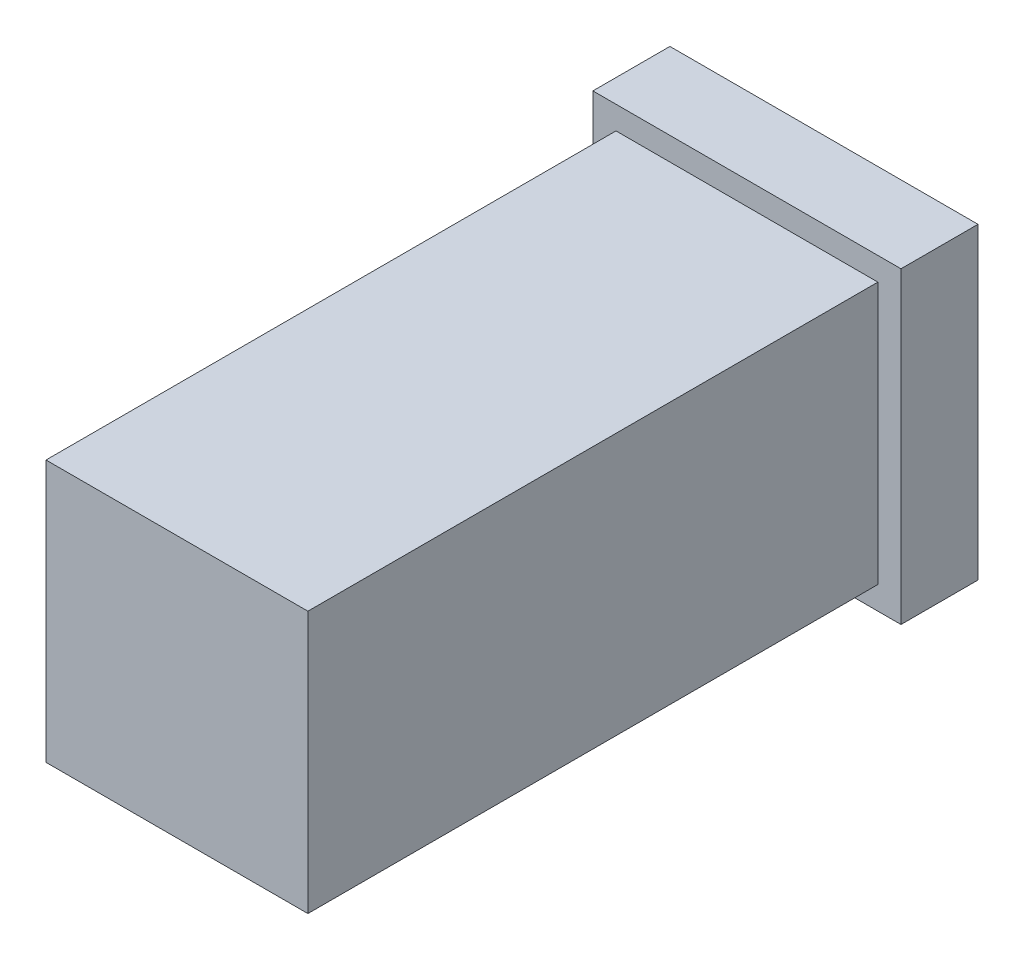
ISO-10303-21;
HEADER;
FILE_DESCRIPTION(('STEP AP214'),'2;1');
FILE_NAME('part.step','',(''),(''),'','','');
FILE_SCHEMA(('AUTOMOTIVE_DESIGN { 1 0 10303 214 1 1 1 1 }'));
ENDSEC;
DATA;
#1=APPLICATION_CONTEXT('core data for automotive mechanical design processes');
#2=APPLICATION_PROTOCOL_DEFINITION('international standard','automotive_design',2000,#1);
#3=PRODUCT_CONTEXT('',#1,'mechanical');
#4=PRODUCT('Part','Part','',(#3));
#5=PRODUCT_RELATED_PRODUCT_CATEGORY('part','',(#4));
#6=PRODUCT_DEFINITION_FORMATION('','',#4);
#7=PRODUCT_DEFINITION_CONTEXT('part definition',#1,'design');
#8=PRODUCT_DEFINITION('design','',#6,#7);
#9=PRODUCT_DEFINITION_SHAPE('','',#8);
#10=(LENGTH_UNIT() NAMED_UNIT(*) SI_UNIT(.MILLI.,.METRE.));
#11=(NAMED_UNIT(*) PLANE_ANGLE_UNIT() SI_UNIT($,.RADIAN.));
#12=(NAMED_UNIT(*) SI_UNIT($,.STERADIAN.) SOLID_ANGLE_UNIT());
#13=UNCERTAINTY_MEASURE_WITH_UNIT(LENGTH_MEASURE(1.E-05),#10,'distance_accuracy_value','');
#14=(GEOMETRIC_REPRESENTATION_CONTEXT(3) GLOBAL_UNCERTAINTY_ASSIGNED_CONTEXT((#13)) GLOBAL_UNIT_ASSIGNED_CONTEXT((#10,
#11,#12)) REPRESENTATION_CONTEXT('',''));
#15=CARTESIAN_POINT('',(0.,0.,0.));
#16=DIRECTION('',(0.,0.,1.));
#17=DIRECTION('',(1.,0.,0.));
#18=AXIS2_PLACEMENT_3D('',#15,#16,#17);
#19=CARTESIAN_POINT('',(9.9999999999999,9.99999999999984,5.));
#20=DIRECTION('',(-1.,0.,0.));
#21=DIRECTION('',(0.,0.,1.));
#22=AXIS2_PLACEMENT_3D('',#19,#20,#21);
#23=PLANE('',#22);
#24=DIRECTION('',(0.,1.,0.));
#25=VECTOR('',#24,1.);
#26=CARTESIAN_POINT('',(10.,10.,0.));
#27=LINE('',#26,#25);
#28=CARTESIAN_POINT('',(10.,-10.0000000000001,0.));
#29=VERTEX_POINT('',#28);
#30=CARTESIAN_POINT('',(10.,10.,0.));
#31=VERTEX_POINT('',#30);
#32=EDGE_CURVE('E131',#29,#31,#27,.T.);
#33=ORIENTED_EDGE('',*,*,#32,.T.);
#34=DIRECTION('',(0.,0.,-1.));
#35=VECTOR('',#34,1.);
#36=CARTESIAN_POINT('',(9.9999999999999,9.99999999999984,5.));
#37=LINE('',#36,#35);
#38=CARTESIAN_POINT('',(9.9999999999999,9.99999999999984,5.));
#39=VERTEX_POINT('',#38);
#40=EDGE_CURVE('E13',#39,#31,#37,.T.);
#41=ORIENTED_EDGE('',*,*,#40,.F.);
#42=DIRECTION('',(0.,1.,0.));
#43=VECTOR('',#42,1.);
#44=CARTESIAN_POINT('',(9.9999999999999,9.99999999999984,5.));
#45=LINE('',#44,#43);
#46=CARTESIAN_POINT('',(10.,-10.0000000000001,5.00000000000006));
#47=VERTEX_POINT('',#46);
#48=EDGE_CURVE('E140',#47,#39,#45,.T.);
#49=ORIENTED_EDGE('',*,*,#48,.F.);
#50=DIRECTION('',(0.,0.,-1.));
#51=VECTOR('',#50,1.);
#52=CARTESIAN_POINT('',(10.,-10.0000000000001,5.00000000000006));
#53=LINE('',#52,#51);
#54=EDGE_CURVE('E149',#47,#29,#53,.T.);
#55=ORIENTED_EDGE('',*,*,#54,.T.);
#56=EDGE_LOOP('',(#33,#41,#49,#55));
#57=FACE_BOUND('',#56,.T.);
#58=ADVANCED_FACE('F47',(#57),#23,.F.);
#59=CARTESIAN_POINT('',(-10.0000000000001,9.99999999999995,5.));
#60=DIRECTION('',(0.,-1.,0.));
#61=DIRECTION('',(0.,0.,-1.));
#62=AXIS2_PLACEMENT_3D('',#59,#60,#61);
#63=PLANE('',#62);
#64=DIRECTION('',(-1.,0.,0.));
#65=VECTOR('',#64,1.);
#66=CARTESIAN_POINT('',(-10.,10.,0.));
#67=LINE('',#66,#65);
#68=CARTESIAN_POINT('',(-10.,10.,0.));
#69=VERTEX_POINT('',#68);
#70=EDGE_CURVE('E134',#31,#69,#67,.T.);
#71=ORIENTED_EDGE('',*,*,#70,.T.);
#72=DIRECTION('',(0.,0.,-1.));
#73=VECTOR('',#72,1.);
#74=CARTESIAN_POINT('',(-10.0000000000001,9.99999999999995,5.));
#75=LINE('',#74,#73);
#76=CARTESIAN_POINT('',(-10.0000000000001,9.99999999999995,5.));
#77=VERTEX_POINT('',#76);
#78=EDGE_CURVE('E54',#77,#69,#75,.T.);
#79=ORIENTED_EDGE('',*,*,#78,.F.);
#80=DIRECTION('',(-1.,0.,0.));
#81=VECTOR('',#80,1.);
#82=CARTESIAN_POINT('',(-10.0000000000001,9.99999999999995,5.));
#83=LINE('',#82,#81);
#84=EDGE_CURVE('E143',#39,#77,#83,.T.);
#85=ORIENTED_EDGE('',*,*,#84,.F.);
#86=ORIENTED_EDGE('',*,*,#40,.T.);
#87=EDGE_LOOP('',(#71,#79,#85,#86));
#88=FACE_BOUND('',#87,.T.);
#89=ADVANCED_FACE('F180',(#88),#63,.F.);
#90=CARTESIAN_POINT('',(-10.0000000000001,9.99999999999995,5.));
#91=DIRECTION('',(1.,0.,0.));
#92=DIRECTION('',(0.,1.,0.));
#93=AXIS2_PLACEMENT_3D('',#90,#91,#92);
#94=PLANE('',#93);
#95=DIRECTION('',(0.,-1.,0.));
#96=VECTOR('',#95,1.);
#97=CARTESIAN_POINT('',(-10.,10.,0.));
#98=LINE('',#97,#96);
#99=CARTESIAN_POINT('',(-10.,-10.,0.));
#100=VERTEX_POINT('',#99);
#101=EDGE_CURVE('E152',#69,#100,#98,.T.);
#102=ORIENTED_EDGE('',*,*,#101,.T.);
#103=DIRECTION('',(0.,0.,-1.));
#104=VECTOR('',#103,1.);
#105=CARTESIAN_POINT('',(-10.,-10.0000000000001,5.));
#106=LINE('',#105,#104);
#107=CARTESIAN_POINT('',(-10.,-10.0000000000001,5.));
#108=VERTEX_POINT('',#107);
#109=EDGE_CURVE('E157',#108,#100,#106,.T.);
#110=ORIENTED_EDGE('',*,*,#109,.F.);
#111=DIRECTION('',(0.,-1.,0.));
#112=VECTOR('',#111,1.);
#113=CARTESIAN_POINT('',(-10.0000000000001,9.99999999999995,5.));
#114=LINE('',#113,#112);
#115=EDGE_CURVE('E146',#77,#108,#114,.T.);
#116=ORIENTED_EDGE('',*,*,#115,.F.);
#117=ORIENTED_EDGE('',*,*,#78,.T.);
#118=EDGE_LOOP('',(#102,#110,#116,#117));
#119=FACE_BOUND('',#118,.T.);
#120=ADVANCED_FACE('F164',(#119),#94,.F.);
#121=CARTESIAN_POINT('',(-10.,-10.0000000000001,5.));
#122=DIRECTION('',(0.,1.,0.));
#123=DIRECTION('',(0.,0.,1.));
#124=AXIS2_PLACEMENT_3D('',#121,#122,#123);
#125=PLANE('',#124);
#126=DIRECTION('',(1.,0.,0.));
#127=VECTOR('',#126,1.);
#128=CARTESIAN_POINT('',(-10.,-10.,0.));
#129=LINE('',#128,#127);
#130=EDGE_CURVE('E144',#100,#29,#129,.T.);
#131=ORIENTED_EDGE('',*,*,#130,.T.);
#132=ORIENTED_EDGE('',*,*,#54,.F.);
#133=DIRECTION('',(1.,0.,0.));
#134=VECTOR('',#133,1.);
#135=CARTESIAN_POINT('',(-10.,-10.0000000000001,5.));
#136=LINE('',#135,#134);
#137=EDGE_CURVE('E148',#108,#47,#136,.T.);
#138=ORIENTED_EDGE('',*,*,#137,.F.);
#139=ORIENTED_EDGE('',*,*,#109,.T.);
#140=EDGE_LOOP('',(#131,#132,#138,#139));
#141=FACE_BOUND('',#140,.T.);
#142=ADVANCED_FACE('F173',(#141),#125,.F.);
#143=CARTESIAN_POINT('',(0.,0.,5.));
#144=DIRECTION('',(0.,0.,1.));
#145=DIRECTION('',(1.,0.,0.));
#146=AXIS2_PLACEMENT_3D('',#143,#144,#145);
#147=PLANE('',#146);
#148=DIRECTION('',(0.,1.,0.));
#149=VECTOR('',#148,1.);
#150=CARTESIAN_POINT('',(8.49999999999995,8.50000000000001,5.));
#151=LINE('',#150,#149);
#152=CARTESIAN_POINT('',(8.4999999999999,-8.49999999999995,5.00000000000003));
#153=VERTEX_POINT('',#152);
#154=CARTESIAN_POINT('',(8.49999999999995,8.50000000000001,5.));
#155=VERTEX_POINT('',#154);
#156=EDGE_CURVE('E61',#153,#155,#151,.T.);
#157=ORIENTED_EDGE('',*,*,#156,.F.);
#158=DIRECTION('',(1.,0.,0.));
#159=VECTOR('',#158,1.);
#160=CARTESIAN_POINT('',(-8.50000000000012,-8.50000000000006,5.00000000000009));
#161=LINE('',#160,#159);
#162=CARTESIAN_POINT('',(-8.50000000000012,-8.50000000000006,5.00000000000009));
#163=VERTEX_POINT('',#162);
#164=EDGE_CURVE('E65',#163,#153,#161,.T.);
#165=ORIENTED_EDGE('',*,*,#164,.F.);
#166=DIRECTION('',(0.,-1.,0.));
#167=VECTOR('',#166,1.);
#168=CARTESIAN_POINT('',(-8.50000000000006,8.50000000000006,5.00000000000006));
#169=LINE('',#168,#167);
#170=CARTESIAN_POINT('',(-8.50000000000006,8.50000000000006,5.00000000000006));
#171=VERTEX_POINT('',#170);
#172=EDGE_CURVE('E232',#171,#163,#169,.T.);
#173=ORIENTED_EDGE('',*,*,#172,.F.);
#174=DIRECTION('',(-1.,0.,0.));
#175=VECTOR('',#174,1.);
#176=CARTESIAN_POINT('',(-8.50000000000006,8.50000000000006,5.00000000000006));
#177=LINE('',#176,#175);
#178=EDGE_CURVE('E223',#155,#171,#177,.T.);
#179=ORIENTED_EDGE('',*,*,#178,.F.);
#180=EDGE_LOOP('',(#157,#165,#173,#179));
#181=FACE_BOUND('',#180,.T.);
#182=ORIENTED_EDGE('',*,*,#48,.T.);
#183=ORIENTED_EDGE('',*,*,#84,.T.);
#184=ORIENTED_EDGE('',*,*,#115,.T.);
#185=ORIENTED_EDGE('',*,*,#137,.T.);
#186=EDGE_LOOP('',(#182,#183,#184,#185));
#187=FACE_BOUND('',#186,.T.);
#188=ADVANCED_FACE('F179',(#181,#187),#147,.T.);
#189=CARTESIAN_POINT('',(0.,0.,0.));
#190=DIRECTION('',(0.,0.,1.));
#191=DIRECTION('',(1.,0.,0.));
#192=AXIS2_PLACEMENT_3D('',#189,#190,#191);
#193=PLANE('',#192);
#194=CARTESIAN_POINT('',(0.,0.,0.));
#195=DIRECTION('',(0.,0.,-1.));
#196=DIRECTION('',(-1.,0.,0.));
#197=AXIS2_PLACEMENT_3D('',#194,#195,#196);
#198=CIRCLE('',#197,4.);
#199=CARTESIAN_POINT('',(-4.00000000000001,0.,0.));
#200=VERTEX_POINT('',#199);
#201=EDGE_CURVE('E221',#200,#200,#198,.T.);
#202=ORIENTED_EDGE('',*,*,#201,.F.);
#203=EDGE_LOOP('',(#202));
#204=FACE_BOUND('',#203,.T.);
#205=ORIENTED_EDGE('',*,*,#32,.F.);
#206=ORIENTED_EDGE('',*,*,#130,.F.);
#207=ORIENTED_EDGE('',*,*,#101,.F.);
#208=ORIENTED_EDGE('',*,*,#70,.F.);
#209=EDGE_LOOP('',(#205,#206,#207,#208));
#210=FACE_BOUND('',#209,.T.);
#211=ADVANCED_FACE('F170',(#204,#210),#193,.F.);
#212=CARTESIAN_POINT('',(8.50000000000006,8.50000000000012,41.9999999999999));
#213=DIRECTION('',(-1.,0.,0.));
#214=DIRECTION('',(0.,-1.,0.));
#215=AXIS2_PLACEMENT_3D('',#212,#213,#214);
#216=PLANE('',#215);
#217=ORIENTED_EDGE('',*,*,#156,.T.);
#218=DIRECTION('',(0.,0.,-1.));
#219=VECTOR('',#218,1.);
#220=CARTESIAN_POINT('',(8.50000000000006,8.50000000000012,41.9999999999999));
#221=LINE('',#220,#219);
#222=CARTESIAN_POINT('',(8.50000000000006,8.50000000000012,41.9999999999999));
#223=VERTEX_POINT('',#222);
#224=EDGE_CURVE('E114',#223,#155,#221,.T.);
#225=ORIENTED_EDGE('',*,*,#224,.F.);
#226=DIRECTION('',(0.,1.,0.));
#227=VECTOR('',#226,1.);
#228=CARTESIAN_POINT('',(8.50000000000006,8.50000000000012,41.9999999999999));
#229=LINE('',#228,#227);
#230=CARTESIAN_POINT('',(8.49999999999995,-8.49999999999984,42.));
#231=VERTEX_POINT('',#230);
#232=EDGE_CURVE('E120',#231,#223,#229,.T.);
#233=ORIENTED_EDGE('',*,*,#232,.F.);
#234=DIRECTION('',(0.,0.,-1.));
#235=VECTOR('',#234,1.);
#236=CARTESIAN_POINT('',(8.49999999999995,-8.49999999999984,42.));
#237=LINE('',#236,#235);
#238=EDGE_CURVE('E229',#231,#153,#237,.T.);
#239=ORIENTED_EDGE('',*,*,#238,.T.);
#240=EDGE_LOOP('',(#217,#225,#233,#239));
#241=FACE_BOUND('',#240,.T.);
#242=ADVANCED_FACE('F130',(#241),#216,.F.);
#243=CARTESIAN_POINT('',(-8.50000000000001,8.50000000000006,42.));
#244=DIRECTION('',(0.,-1.,0.));
#245=DIRECTION('',(0.,0.,-1.));
#246=AXIS2_PLACEMENT_3D('',#243,#244,#245);
#247=PLANE('',#246);
#248=ORIENTED_EDGE('',*,*,#178,.T.);
#249=DIRECTION('',(0.,0.,-1.));
#250=VECTOR('',#249,1.);
#251=CARTESIAN_POINT('',(-8.50000000000001,8.50000000000006,42.));
#252=LINE('',#251,#250);
#253=CARTESIAN_POINT('',(-8.50000000000001,8.50000000000006,42.));
#254=VERTEX_POINT('',#253);
#255=EDGE_CURVE('E116',#254,#171,#252,.T.);
#256=ORIENTED_EDGE('',*,*,#255,.F.);
#257=DIRECTION('',(-1.,0.,0.));
#258=VECTOR('',#257,1.);
#259=CARTESIAN_POINT('',(-8.50000000000001,8.50000000000006,42.));
#260=LINE('',#259,#258);
#261=EDGE_CURVE('E109',#223,#254,#260,.T.);
#262=ORIENTED_EDGE('',*,*,#261,.F.);
#263=ORIENTED_EDGE('',*,*,#224,.T.);
#264=EDGE_LOOP('',(#248,#256,#262,#263));
#265=FACE_BOUND('',#264,.T.);
#266=ADVANCED_FACE('F112',(#265),#247,.F.);
#267=CARTESIAN_POINT('',(-8.50000000000001,8.50000000000006,42.));
#268=DIRECTION('',(1.,0.,0.));
#269=DIRECTION('',(0.,1.,0.));
#270=AXIS2_PLACEMENT_3D('',#267,#268,#269);
#271=PLANE('',#270);
#272=ORIENTED_EDGE('',*,*,#172,.T.);
#273=DIRECTION('',(0.,0.,-1.));
#274=VECTOR('',#273,1.);
#275=CARTESIAN_POINT('',(-8.50000000000012,-8.50000000000001,42.));
#276=LINE('',#275,#274);
#277=CARTESIAN_POINT('',(-8.50000000000012,-8.50000000000001,42.));
#278=VERTEX_POINT('',#277);
#279=EDGE_CURVE('E136',#278,#163,#276,.T.);
#280=ORIENTED_EDGE('',*,*,#279,.F.);
#281=DIRECTION('',(0.,-1.,0.));
#282=VECTOR('',#281,1.);
#283=CARTESIAN_POINT('',(-8.50000000000001,8.50000000000006,42.));
#284=LINE('',#283,#282);
#285=EDGE_CURVE('E119',#254,#278,#284,.T.);
#286=ORIENTED_EDGE('',*,*,#285,.F.);
#287=ORIENTED_EDGE('',*,*,#255,.T.);
#288=EDGE_LOOP('',(#272,#280,#286,#287));
#289=FACE_BOUND('',#288,.T.);
#290=ADVANCED_FACE('F199',(#289),#271,.F.);
#291=CARTESIAN_POINT('',(-8.50000000000012,-8.50000000000001,42.));
#292=DIRECTION('',(0.,1.,0.));
#293=DIRECTION('',(0.,0.,1.));
#294=AXIS2_PLACEMENT_3D('',#291,#292,#293);
#295=PLANE('',#294);
#296=ORIENTED_EDGE('',*,*,#164,.T.);
#297=ORIENTED_EDGE('',*,*,#238,.F.);
#298=DIRECTION('',(1.,0.,0.));
#299=VECTOR('',#298,1.);
#300=CARTESIAN_POINT('',(-8.50000000000012,-8.50000000000001,42.));
#301=LINE('',#300,#299);
#302=EDGE_CURVE('E125',#278,#231,#301,.T.);
#303=ORIENTED_EDGE('',*,*,#302,.F.);
#304=ORIENTED_EDGE('',*,*,#279,.T.);
#305=EDGE_LOOP('',(#296,#297,#303,#304));
#306=FACE_BOUND('',#305,.T.);
#307=ADVANCED_FACE('F202',(#306),#295,.F.);
#308=CARTESIAN_POINT('',(0.,0.,42.));
#309=DIRECTION('',(0.,0.,1.));
#310=DIRECTION('',(1.,0.,0.));
#311=AXIS2_PLACEMENT_3D('',#308,#309,#310);
#312=PLANE('',#311);
#313=ORIENTED_EDGE('',*,*,#232,.T.);
#314=ORIENTED_EDGE('',*,*,#261,.T.);
#315=ORIENTED_EDGE('',*,*,#285,.T.);
#316=ORIENTED_EDGE('',*,*,#302,.T.);
#317=EDGE_LOOP('',(#313,#314,#315,#316));
#318=FACE_BOUND('',#317,.T.);
#319=ADVANCED_FACE('F123',(#318),#312,.T.);
#320=CARTESIAN_POINT('',(0.,0.,10.));
#321=DIRECTION('',(0.,0.,-1.));
#322=DIRECTION('',(-1.,0.,0.));
#323=AXIS2_PLACEMENT_3D('',#320,#321,#322);
#324=CYLINDRICAL_SURFACE('',#323,4.);
#325=CARTESIAN_POINT('',(0.,0.,10.));
#326=DIRECTION('',(0.,0.,-1.));
#327=DIRECTION('',(-1.,0.,0.));
#328=AXIS2_PLACEMENT_3D('',#325,#326,#327);
#329=CIRCLE('',#328,4.);
#330=CARTESIAN_POINT('',(-4.00000000000006,0.,10.));
#331=VERTEX_POINT('',#330);
#332=EDGE_CURVE('E220',#331,#331,#329,.T.);
#333=ORIENTED_EDGE('',*,*,#332,.F.);
#334=EDGE_LOOP('',(#333));
#335=FACE_BOUND('',#334,.T.);
#336=ORIENTED_EDGE('',*,*,#201,.T.);
#337=EDGE_LOOP('',(#336));
#338=FACE_BOUND('',#337,.T.);
#339=ADVANCED_FACE('F209',(#335,#338),#324,.F.);
#340=CARTESIAN_POINT('',(0.,0.,10.));
#341=DIRECTION('',(0.,0.,-1.));
#342=DIRECTION('',(-1.,0.,0.));
#343=AXIS2_PLACEMENT_3D('',#340,#341,#342);
#344=PLANE('',#343);
#345=ORIENTED_EDGE('',*,*,#332,.T.);
#346=EDGE_LOOP('',(#345));
#347=FACE_BOUND('',#346,.T.);
#348=ADVANCED_FACE('F212',(#347),#344,.T.);
#349=CLOSED_SHELL('',(#58,#89,#120,#142,#188,#211,#242,#266,#290,#307,#319,#339,#348));
#350=MANIFOLD_SOLID_BREP('B2',#349);
#351=ADVANCED_BREP_SHAPE_REPRESENTATION('',(#18,#350),#14);
#352=SHAPE_DEFINITION_REPRESENTATION(#9,#351);
ENDSEC;
END-ISO-10303-21;
